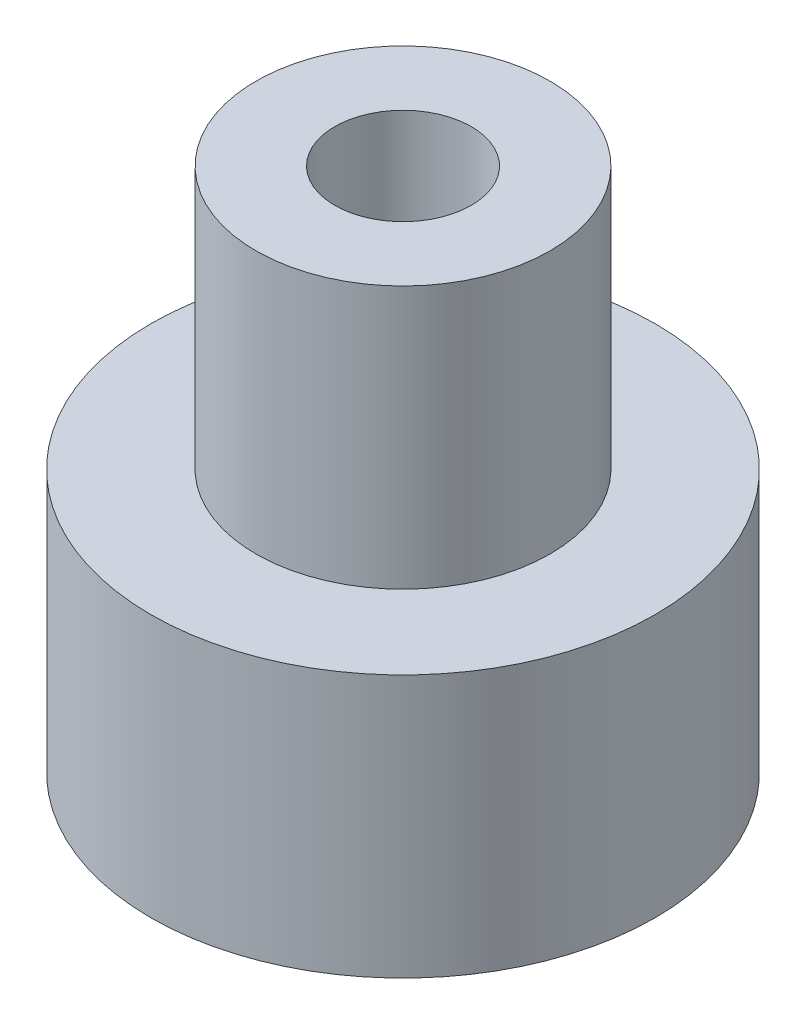
ISO-10303-21;
HEADER;
FILE_DESCRIPTION(('STEP AP214'),'2;1');
FILE_NAME('part.step','',(''),(''),'','','');
FILE_SCHEMA(('AUTOMOTIVE_DESIGN { 1 0 10303 214 1 1 1 1 }'));
ENDSEC;
DATA;
#1=APPLICATION_CONTEXT('core data for automotive mechanical design processes');
#2=APPLICATION_PROTOCOL_DEFINITION('international standard','automotive_design',2000,#1);
#3=PRODUCT_CONTEXT('',#1,'mechanical');
#4=PRODUCT('Part','Part','',(#3));
#5=PRODUCT_RELATED_PRODUCT_CATEGORY('part','',(#4));
#6=PRODUCT_DEFINITION_FORMATION('','',#4);
#7=PRODUCT_DEFINITION_CONTEXT('part definition',#1,'design');
#8=PRODUCT_DEFINITION('design','',#6,#7);
#9=PRODUCT_DEFINITION_SHAPE('','',#8);
#10=(LENGTH_UNIT() NAMED_UNIT(*) SI_UNIT(.MILLI.,.METRE.));
#11=(NAMED_UNIT(*) PLANE_ANGLE_UNIT() SI_UNIT($,.RADIAN.));
#12=(NAMED_UNIT(*) SI_UNIT($,.STERADIAN.) SOLID_ANGLE_UNIT());
#13=UNCERTAINTY_MEASURE_WITH_UNIT(LENGTH_MEASURE(1.E-05),#10,'distance_accuracy_value','');
#14=(GEOMETRIC_REPRESENTATION_CONTEXT(3) GLOBAL_UNCERTAINTY_ASSIGNED_CONTEXT((#13)) GLOBAL_UNIT_ASSIGNED_CONTEXT((#10,
#11,#12)) REPRESENTATION_CONTEXT('',''));
#15=CARTESIAN_POINT('',(0.,0.,0.));
#16=DIRECTION('',(0.,0.,1.));
#17=DIRECTION('',(1.,0.,0.));
#18=AXIS2_PLACEMENT_3D('',#15,#16,#17);
#19=CARTESIAN_POINT('',(3.43024899888577E-12,-1000.,0.));
#20=DIRECTION('',(0.,-1.,0.));
#21=DIRECTION('',(1.,0.,0.));
#22=AXIS2_PLACEMENT_3D('',#19,#20,#21);
#23=CYLINDRICAL_SURFACE('',#22,1.3);
#24=CARTESIAN_POINT('',(0.,4.99999999999989,0.));
#25=DIRECTION('',(0.,-1.,0.));
#26=DIRECTION('',(1.,0.,0.));
#27=AXIS2_PLACEMENT_3D('',#24,#25,#26);
#28=CIRCLE('',#27,1.29999999999998);
#29=CARTESIAN_POINT('',(1.29999999999997,4.9999999999999,0.));
#30=VERTEX_POINT('',#29);
#31=EDGE_CURVE('E10',#30,#30,#28,.T.);
#32=ORIENTED_EDGE('',*,*,#31,.F.);
#33=EDGE_LOOP('',(#32));
#34=FACE_BOUND('',#33,.T.);
#35=CARTESIAN_POINT('',(0.,-5.,0.));
#36=DIRECTION('',(0.,-1.,0.));
#37=DIRECTION('',(1.,0.,0.));
#38=AXIS2_PLACEMENT_3D('',#35,#36,#37);
#39=CIRCLE('',#38,1.30000000000001);
#40=CARTESIAN_POINT('',(1.30000000000003,-5.,0.));
#41=VERTEX_POINT('',#40);
#42=EDGE_CURVE('E53',#41,#41,#39,.T.);
#43=ORIENTED_EDGE('',*,*,#42,.T.);
#44=EDGE_LOOP('',(#43));
#45=FACE_BOUND('',#44,.T.);
#46=ADVANCED_FACE('F31',(#34,#45),#23,.F.);
#47=CARTESIAN_POINT('',(-1.3,5.,0.));
#48=DIRECTION('',(0.,-1.,0.));
#49=DIRECTION('',(1.,0.,0.));
#50=AXIS2_PLACEMENT_3D('',#47,#48,#49);
#51=PLANE('',#50);
#52=CARTESIAN_POINT('',(0.,4.99999999999989,0.));
#53=DIRECTION('',(0.,-1.,0.));
#54=DIRECTION('',(1.,0.,0.));
#55=AXIS2_PLACEMENT_3D('',#52,#53,#54);
#56=CIRCLE('',#55,2.80000000000011);
#57=CARTESIAN_POINT('',(2.80000000000009,4.9999999999999,0.));
#58=VERTEX_POINT('',#57);
#59=EDGE_CURVE('E37',#58,#58,#56,.T.);
#60=ORIENTED_EDGE('',*,*,#59,.F.);
#61=EDGE_LOOP('',(#60));
#62=FACE_BOUND('',#61,.T.);
#63=ORIENTED_EDGE('',*,*,#31,.T.);
#64=EDGE_LOOP('',(#63));
#65=FACE_BOUND('',#64,.T.);
#66=ADVANCED_FACE('F78',(#62,#65),#51,.F.);
#67=CARTESIAN_POINT('',(3.43024899888577E-12,-1000.,0.));
#68=DIRECTION('',(0.,-1.,0.));
#69=DIRECTION('',(1.,0.,0.));
#70=AXIS2_PLACEMENT_3D('',#67,#68,#69);
#71=CYLINDRICAL_SURFACE('',#70,2.80000000000011);
#72=CARTESIAN_POINT('',(0.,0.,0.));
#73=DIRECTION('',(0.,-1.,0.));
#74=DIRECTION('',(1.,0.,0.));
#75=AXIS2_PLACEMENT_3D('',#72,#73,#74);
#76=CIRCLE('',#75,2.80000000000012);
#77=CARTESIAN_POINT('',(2.80000000000012,0.,0.));
#78=VERTEX_POINT('',#77);
#79=EDGE_CURVE('E41',#78,#78,#76,.T.);
#80=ORIENTED_EDGE('',*,*,#79,.F.);
#81=EDGE_LOOP('',(#80));
#82=FACE_BOUND('',#81,.T.);
#83=ORIENTED_EDGE('',*,*,#59,.T.);
#84=EDGE_LOOP('',(#83));
#85=FACE_BOUND('',#84,.T.);
#86=ADVANCED_FACE('F73',(#82,#85),#71,.T.);
#87=CARTESIAN_POINT('',(-2.80000000000012,0.,0.));
#88=DIRECTION('',(0.,-1.,0.));
#89=DIRECTION('',(1.,0.,0.));
#90=AXIS2_PLACEMENT_3D('',#87,#88,#89);
#91=PLANE('',#90);
#92=CARTESIAN_POINT('',(0.,0.,0.));
#93=DIRECTION('',(0.,-1.,0.));
#94=DIRECTION('',(1.,0.,0.));
#95=AXIS2_PLACEMENT_3D('',#92,#93,#94);
#96=CIRCLE('',#95,4.80000000000011);
#97=CARTESIAN_POINT('',(4.80000000000011,0.,0.));
#98=VERTEX_POINT('',#97);
#99=EDGE_CURVE('E45',#98,#98,#96,.T.);
#100=ORIENTED_EDGE('',*,*,#99,.F.);
#101=EDGE_LOOP('',(#100));
#102=FACE_BOUND('',#101,.T.);
#103=ORIENTED_EDGE('',*,*,#79,.T.);
#104=EDGE_LOOP('',(#103));
#105=FACE_BOUND('',#104,.T.);
#106=ADVANCED_FACE('F67',(#102,#105),#91,.F.);
#107=CARTESIAN_POINT('',(3.43024899888577E-12,-1000.,0.));
#108=DIRECTION('',(0.,-1.,0.));
#109=DIRECTION('',(1.,0.,0.));
#110=AXIS2_PLACEMENT_3D('',#107,#108,#109);
#111=CYLINDRICAL_SURFACE('',#110,4.80000000000013);
#112=CARTESIAN_POINT('',(0.,-5.,0.));
#113=DIRECTION('',(0.,-1.,0.));
#114=DIRECTION('',(1.,0.,0.));
#115=AXIS2_PLACEMENT_3D('',#112,#113,#114);
#116=CIRCLE('',#115,4.80000000000014);
#117=CARTESIAN_POINT('',(4.80000000000016,-4.99999999999999,0.));
#118=VERTEX_POINT('',#117);
#119=EDGE_CURVE('E50',#118,#118,#116,.T.);
#120=ORIENTED_EDGE('',*,*,#119,.F.);
#121=EDGE_LOOP('',(#120));
#122=FACE_BOUND('',#121,.T.);
#123=ORIENTED_EDGE('',*,*,#99,.T.);
#124=EDGE_LOOP('',(#123));
#125=FACE_BOUND('',#124,.T.);
#126=ADVANCED_FACE('F61',(#122,#125),#111,.T.);
#127=CARTESIAN_POINT('',(-4.80000000000012,-5.00000000000001,0.));
#128=DIRECTION('',(0.,1.,0.));
#129=DIRECTION('',(-1.,0.,0.));
#130=AXIS2_PLACEMENT_3D('',#127,#128,#129);
#131=PLANE('',#130);
#132=ORIENTED_EDGE('',*,*,#42,.F.);
#133=EDGE_LOOP('',(#132));
#134=FACE_BOUND('',#133,.T.);
#135=ORIENTED_EDGE('',*,*,#119,.T.);
#136=EDGE_LOOP('',(#135));
#137=FACE_BOUND('',#136,.T.);
#138=ADVANCED_FACE('F58',(#134,#137),#131,.F.);
#139=CLOSED_SHELL('',(#46,#66,#86,#106,#126,#138));
#140=MANIFOLD_SOLID_BREP('B2',#139);
#141=ADVANCED_BREP_SHAPE_REPRESENTATION('',(#18,#140),#14);
#142=SHAPE_DEFINITION_REPRESENTATION(#9,#141);
ENDSEC;
END-ISO-10303-21;
